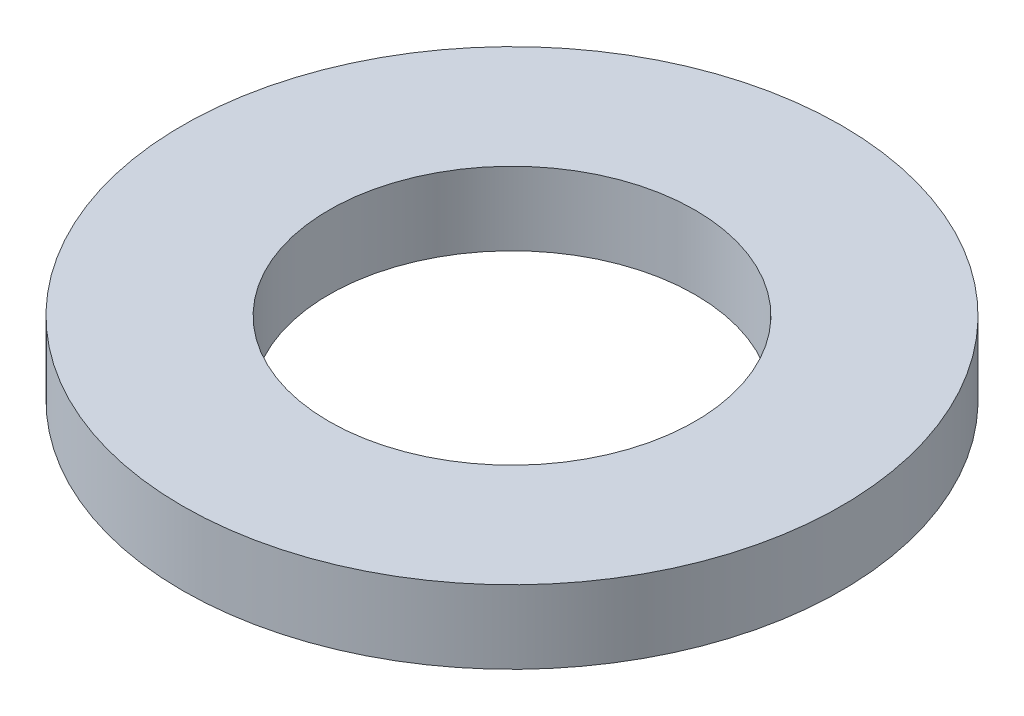
ISO-10303-21;
HEADER;
FILE_DESCRIPTION(('STEP AP214'),'2;1');
FILE_NAME('part.step','',(''),(''),'','','');
FILE_SCHEMA(('AUTOMOTIVE_DESIGN { 1 0 10303 214 1 1 1 1 }'));
ENDSEC;
DATA;
#1=APPLICATION_CONTEXT('core data for automotive mechanical design processes');
#2=APPLICATION_PROTOCOL_DEFINITION('international standard','automotive_design',2000,#1);
#3=PRODUCT_CONTEXT('',#1,'mechanical');
#4=PRODUCT('Part','Part','',(#3));
#5=PRODUCT_RELATED_PRODUCT_CATEGORY('part','',(#4));
#6=PRODUCT_DEFINITION_FORMATION('','',#4);
#7=PRODUCT_DEFINITION_CONTEXT('part definition',#1,'design');
#8=PRODUCT_DEFINITION('design','',#6,#7);
#9=PRODUCT_DEFINITION_SHAPE('','',#8);
#10=(LENGTH_UNIT() NAMED_UNIT(*) SI_UNIT(.MILLI.,.METRE.));
#11=(NAMED_UNIT(*) PLANE_ANGLE_UNIT() SI_UNIT($,.RADIAN.));
#12=(NAMED_UNIT(*) SI_UNIT($,.STERADIAN.) SOLID_ANGLE_UNIT());
#13=UNCERTAINTY_MEASURE_WITH_UNIT(LENGTH_MEASURE(1.E-05),#10,'distance_accuracy_value','');
#14=(GEOMETRIC_REPRESENTATION_CONTEXT(3) GLOBAL_UNCERTAINTY_ASSIGNED_CONTEXT((#13)) GLOBAL_UNIT_ASSIGNED_CONTEXT((#10,
#11,#12)) REPRESENTATION_CONTEXT('',''));
#15=CARTESIAN_POINT('',(0.,0.,0.));
#16=DIRECTION('',(0.,0.,1.));
#17=DIRECTION('',(1.,0.,0.));
#18=AXIS2_PLACEMENT_3D('',#15,#16,#17);
#19=CARTESIAN_POINT('',(12.8686463229554,1.,5.));
#20=DIRECTION('',(0.,1.,0.));
#21=DIRECTION('',(0.,0.,1.));
#22=AXIS2_PLACEMENT_3D('',#19,#20,#21);
#23=PLANE('',#22);
#24=CARTESIAN_POINT('',(12.8686463229554,1.,5.));
#25=DIRECTION('',(0.,1.,0.));
#26=DIRECTION('',(0.,0.,1.));
#27=AXIS2_PLACEMENT_3D('',#24,#25,#26);
#28=CIRCLE('',#27,4.5);
#29=CARTESIAN_POINT('',(12.8686463229554,1.,9.5));
#30=VERTEX_POINT('',#29);
#31=EDGE_CURVE('E10',#30,#30,#28,.T.);
#32=ORIENTED_EDGE('',*,*,#31,.T.);
#33=EDGE_LOOP('',(#32));
#34=FACE_BOUND('',#33,.T.);
#35=CARTESIAN_POINT('',(12.8686463229554,1.,5.));
#36=DIRECTION('',(0.,1.,0.));
#37=DIRECTION('',(0.,0.,1.));
#38=AXIS2_PLACEMENT_3D('',#35,#36,#37);
#39=CIRCLE('',#38,2.5);
#40=CARTESIAN_POINT('',(12.8686463229554,1.,7.5));
#41=VERTEX_POINT('',#40);
#42=EDGE_CURVE('E42',#41,#41,#39,.T.);
#43=ORIENTED_EDGE('',*,*,#42,.F.);
#44=EDGE_LOOP('',(#43));
#45=FACE_BOUND('',#44,.T.);
#46=ADVANCED_FACE('F31',(#34,#45),#23,.T.);
#47=CARTESIAN_POINT('',(12.8686463229554,0.,5.));
#48=DIRECTION('',(0.,1.,0.));
#49=DIRECTION('',(0.,0.,1.));
#50=AXIS2_PLACEMENT_3D('',#47,#48,#49);
#51=PLANE('',#50);
#52=CARTESIAN_POINT('',(12.8686463229554,0.,5.));
#53=DIRECTION('',(0.,1.,0.));
#54=DIRECTION('',(0.,0.,1.));
#55=AXIS2_PLACEMENT_3D('',#52,#53,#54);
#56=CIRCLE('',#55,4.5);
#57=CARTESIAN_POINT('',(12.8686463229554,0.,9.5));
#58=VERTEX_POINT('',#57);
#59=EDGE_CURVE('E35',#58,#58,#56,.T.);
#60=ORIENTED_EDGE('',*,*,#59,.F.);
#61=EDGE_LOOP('',(#60));
#62=FACE_BOUND('',#61,.T.);
#63=CARTESIAN_POINT('',(12.8686463229554,0.,5.));
#64=DIRECTION('',(0.,1.,0.));
#65=DIRECTION('',(0.,0.,1.));
#66=AXIS2_PLACEMENT_3D('',#63,#64,#65);
#67=CIRCLE('',#66,2.5);
#68=CARTESIAN_POINT('',(12.8686463229554,0.,7.5));
#69=VERTEX_POINT('',#68);
#70=EDGE_CURVE('E44',#69,#69,#67,.T.);
#71=ORIENTED_EDGE('',*,*,#70,.T.);
#72=EDGE_LOOP('',(#71));
#73=FACE_BOUND('',#72,.T.);
#74=ADVANCED_FACE('F54',(#62,#73),#51,.F.);
#75=CARTESIAN_POINT('',(12.8686463229554,1.,5.));
#76=DIRECTION('',(0.,-1.,0.));
#77=DIRECTION('',(0.,0.,-1.));
#78=AXIS2_PLACEMENT_3D('',#75,#76,#77);
#79=CYLINDRICAL_SURFACE('',#78,4.5);
#80=ORIENTED_EDGE('',*,*,#31,.F.);
#81=EDGE_LOOP('',(#80));
#82=FACE_BOUND('',#81,.T.);
#83=ORIENTED_EDGE('',*,*,#59,.T.);
#84=EDGE_LOOP('',(#83));
#85=FACE_BOUND('',#84,.T.);
#86=ADVANCED_FACE('F33',(#82,#85),#79,.T.);
#87=CARTESIAN_POINT('',(12.8686463229554,1.,5.));
#88=DIRECTION('',(0.,-1.,0.));
#89=DIRECTION('',(0.,0.,-1.));
#90=AXIS2_PLACEMENT_3D('',#87,#88,#89);
#91=CYLINDRICAL_SURFACE('',#90,2.5);
#92=ORIENTED_EDGE('',*,*,#42,.T.);
#93=EDGE_LOOP('',(#92));
#94=FACE_BOUND('',#93,.T.);
#95=ORIENTED_EDGE('',*,*,#70,.F.);
#96=EDGE_LOOP('',(#95));
#97=FACE_BOUND('',#96,.T.);
#98=ADVANCED_FACE('F50',(#94,#97),#91,.F.);
#99=CLOSED_SHELL('',(#46,#74,#86,#98));
#100=MANIFOLD_SOLID_BREP('B2',#99);
#101=ADVANCED_BREP_SHAPE_REPRESENTATION('',(#18,#100),#14);
#102=SHAPE_DEFINITION_REPRESENTATION(#9,#101);
ENDSEC;
END-ISO-10303-21;
